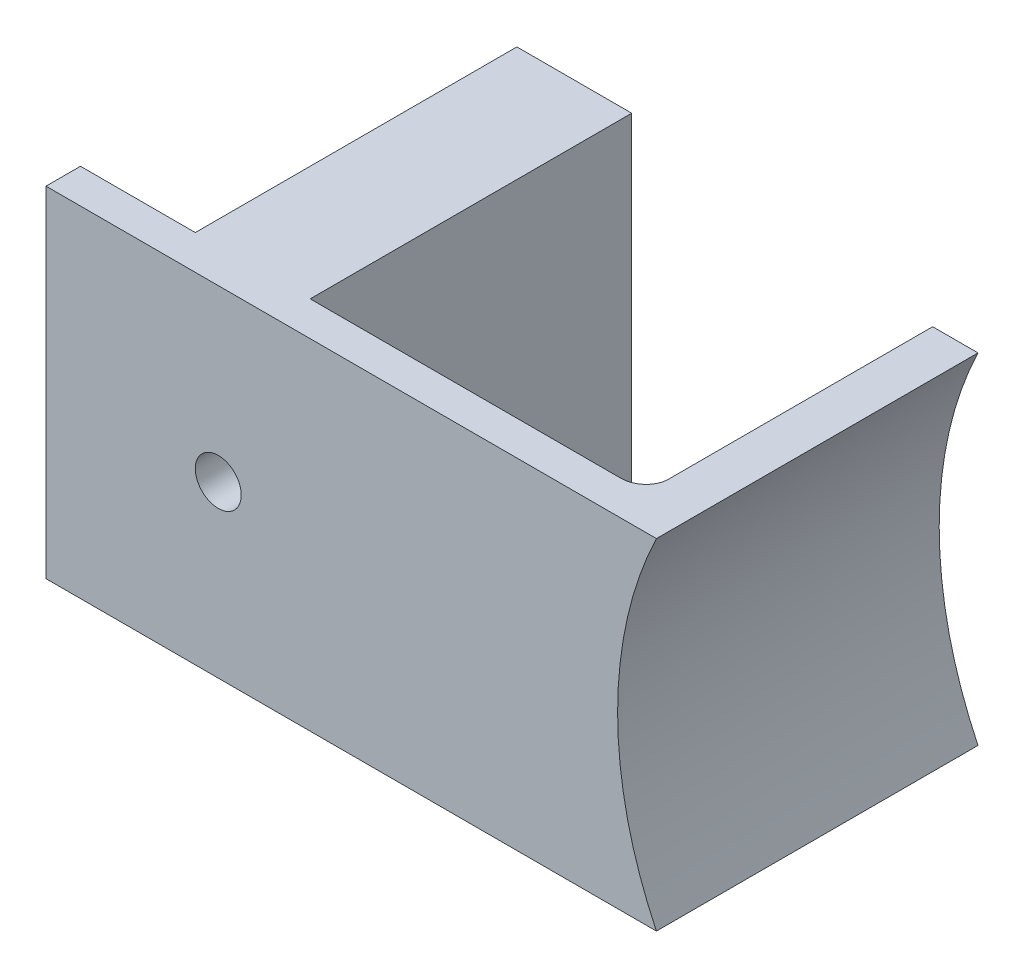
ISO-10303-21;
HEADER;
FILE_DESCRIPTION(('STEP AP214'),'2;1');
FILE_NAME('part.step','',(''),(''),'','','');
FILE_SCHEMA(('AUTOMOTIVE_DESIGN { 1 0 10303 214 1 1 1 1 }'));
ENDSEC;
DATA;
#1=APPLICATION_CONTEXT('core data for automotive mechanical design processes');
#2=APPLICATION_PROTOCOL_DEFINITION('international standard','automotive_design',2000,#1);
#3=PRODUCT_CONTEXT('',#1,'mechanical');
#4=PRODUCT('Part','Part','',(#3));
#5=PRODUCT_RELATED_PRODUCT_CATEGORY('part','',(#4));
#6=PRODUCT_DEFINITION_FORMATION('','',#4);
#7=PRODUCT_DEFINITION_CONTEXT('part definition',#1,'design');
#8=PRODUCT_DEFINITION('design','',#6,#7);
#9=PRODUCT_DEFINITION_SHAPE('','',#8);
#10=(LENGTH_UNIT() NAMED_UNIT(*) SI_UNIT(.MILLI.,.METRE.));
#11=(NAMED_UNIT(*) PLANE_ANGLE_UNIT() SI_UNIT($,.RADIAN.));
#12=(NAMED_UNIT(*) SI_UNIT($,.STERADIAN.) SOLID_ANGLE_UNIT());
#13=UNCERTAINTY_MEASURE_WITH_UNIT(LENGTH_MEASURE(1.E-05),#10,'distance_accuracy_value','');
#14=(GEOMETRIC_REPRESENTATION_CONTEXT(3) GLOBAL_UNCERTAINTY_ASSIGNED_CONTEXT((#13)) GLOBAL_UNIT_ASSIGNED_CONTEXT((#10,
#11,#12)) REPRESENTATION_CONTEXT('',''));
#15=CARTESIAN_POINT('',(0.,0.,0.));
#16=DIRECTION('',(0.,0.,1.));
#17=DIRECTION('',(1.,0.,0.));
#18=AXIS2_PLACEMENT_3D('',#15,#16,#17);
#19=CARTESIAN_POINT('',(2.50538527144924,-1.02140518265514E-13,25.));
#20=DIRECTION('',(0.,0.,1.));
#21=DIRECTION('',(1.,0.,0.));
#22=AXIS2_PLACEMENT_3D('',#19,#20,#21);
#23=PLANE('',#22);
#24=DIRECTION('',(-1.,0.,0.));
#25=VECTOR('',#24,1.);
#26=CARTESIAN_POINT('',(-71.3654900853092,14.7999999999996,25.));
#27=LINE('',#26,#25);
#28=CARTESIAN_POINT('',(-34.3301957244099,14.7999999999996,25.));
#29=VERTEX_POINT('',#28);
#30=CARTESIAN_POINT('',(-61.3654900853092,14.7999999999996,25.));
#31=VERTEX_POINT('',#30);
#32=EDGE_CURVE('E438',#29,#31,#27,.T.);
#33=ORIENTED_EDGE('',*,*,#32,.F.);
#34=CARTESIAN_POINT('',(2.50538527144924,-1.02140518265514E-13,25.));
#35=DIRECTION('',(0.,0.,1.));
#36=DIRECTION('',(1.,0.,0.));
#37=AXIS2_PLACEMENT_3D('',#34,#35,#36);
#38=CIRCLE('',#37,39.6976073246549);
#39=CARTESIAN_POINT('',(-34.3301957244099,-14.7999999999999,25.));
#40=VERTEX_POINT('',#39);
#41=EDGE_CURVE('E59',#29,#40,#38,.T.);
#42=ORIENTED_EDGE('',*,*,#41,.T.);
#43=DIRECTION('',(1.,0.,0.));
#44=VECTOR('',#43,1.);
#45=CARTESIAN_POINT('',(-32.1654900853092,-14.7999999999999,25.));
#46=LINE('',#45,#44);
#47=CARTESIAN_POINT('',(-61.3654900853092,-14.7999999999999,25.));
#48=VERTEX_POINT('',#47);
#49=EDGE_CURVE('E440',#48,#40,#46,.T.);
#50=ORIENTED_EDGE('',*,*,#49,.F.);
#51=DIRECTION('',(0.,-1.,0.));
#52=VECTOR('',#51,1.);
#53=CARTESIAN_POINT('',(-61.3654900853092,-14.7999999999999,25.));
#54=LINE('',#53,#52);
#55=CARTESIAN_POINT('',(-61.3654900853092,-5.00000000000015,25.));
#56=VERTEX_POINT('',#55);
#57=EDGE_CURVE('E418',#56,#48,#54,.T.);
#58=ORIENTED_EDGE('',*,*,#57,.F.);
#59=DIRECTION('',(1.,0.,0.));
#60=VECTOR('',#59,1.);
#61=CARTESIAN_POINT('',(-65.8654900853092,-5.00000000000015,25.));
#62=LINE('',#61,#60);
#63=CARTESIAN_POINT('',(-58.1154900853092,-5.00000000000014,25.));
#64=VERTEX_POINT('',#63);
#65=EDGE_CURVE('E416',#56,#64,#62,.T.);
#66=ORIENTED_EDGE('',*,*,#65,.T.);
#67=DIRECTION('',(0.,1.,0.));
#68=VECTOR('',#67,1.);
#69=CARTESIAN_POINT('',(-58.1154900853092,-5.00000000000014,25.));
#70=LINE('',#69,#68);
#71=CARTESIAN_POINT('',(-58.1154900853092,4.99999999999986,25.));
#72=VERTEX_POINT('',#71);
#73=EDGE_CURVE('E406',#64,#72,#70,.T.);
#74=ORIENTED_EDGE('',*,*,#73,.T.);
#75=DIRECTION('',(1.,0.,0.));
#76=VECTOR('',#75,1.);
#77=CARTESIAN_POINT('',(-65.8654900853092,4.99999999999985,25.));
#78=LINE('',#77,#76);
#79=CARTESIAN_POINT('',(-61.3654900853092,4.99999999999985,25.));
#80=VERTEX_POINT('',#79);
#81=EDGE_CURVE('E413',#80,#72,#78,.T.);
#82=ORIENTED_EDGE('',*,*,#81,.F.);
#83=EDGE_CURVE('E423',#31,#80,#54,.T.);
#84=ORIENTED_EDGE('',*,*,#83,.F.);
#85=EDGE_LOOP('',(#33,#42,#50,#58,#66,#74,#82,#84));
#86=FACE_BOUND('',#85,.T.);
#87=ADVANCED_FACE('F33',(#86),#23,.F.);
#88=CARTESIAN_POINT('',(-61.3654900853092,-14.7999999999999,-3.));
#89=DIRECTION('',(-1.,0.,0.));
#90=DIRECTION('',(0.,0.,1.));
#91=AXIS2_PLACEMENT_3D('',#88,#89,#90);
#92=PLANE('',#91);
#93=CARTESIAN_POINT('',(-61.3654900853092,-1.45921469352217E-13,25.));
#94=DIRECTION('',(-1.,0.,0.));
#95=DIRECTION('',(0.,0.,1.));
#96=AXIS2_PLACEMENT_3D('',#93,#94,#95);
#97=CIRCLE('',#96,5.);
#98=EDGE_CURVE('E205',#56,#80,#97,.F.);
#99=ORIENTED_EDGE('',*,*,#98,.F.);
#100=ORIENTED_EDGE('',*,*,#57,.T.);
#101=DIRECTION('',(0.,0.,1.));
#102=VECTOR('',#101,1.);
#103=CARTESIAN_POINT('',(-61.3654900853092,-14.7999999999999,-3.));
#104=LINE('',#103,#102);
#105=CARTESIAN_POINT('',(-61.3654900853092,-14.7999999999999,-3.));
#106=VERTEX_POINT('',#105);
#107=EDGE_CURVE('E431',#106,#48,#104,.T.);
#108=ORIENTED_EDGE('',*,*,#107,.F.);
#109=DIRECTION('',(0.,-1.,0.));
#110=VECTOR('',#109,1.);
#111=CARTESIAN_POINT('',(-61.3654900853092,-14.7999999999999,-3.));
#112=LINE('',#111,#110);
#113=CARTESIAN_POINT('',(-61.3654900853092,14.7999999999996,-3.));
#114=VERTEX_POINT('',#113);
#115=EDGE_CURVE('E422',#114,#106,#112,.T.);
#116=ORIENTED_EDGE('',*,*,#115,.F.);
#117=DIRECTION('',(0.,0.,1.));
#118=VECTOR('',#117,1.);
#119=CARTESIAN_POINT('',(-61.3654900853092,14.7999999999996,-3.));
#120=LINE('',#119,#118);
#121=EDGE_CURVE('E435',#114,#31,#120,.T.);
#122=ORIENTED_EDGE('',*,*,#121,.T.);
#123=ORIENTED_EDGE('',*,*,#83,.T.);
#124=EDGE_LOOP('',(#99,#100,#108,#116,#122,#123));
#125=FACE_BOUND('',#124,.T.);
#126=ADVANCED_FACE('F230',(#125),#92,.F.);
#127=CARTESIAN_POINT('',(2.50538527144924,-1.02140518265514E-13,28.));
#128=DIRECTION('',(0.,0.,-1.));
#129=DIRECTION('',(-1.,0.,0.));
#130=AXIS2_PLACEMENT_3D('',#127,#128,#129);
#131=CYLINDRICAL_SURFACE('',#130,37.6976073246549);
#132=DIRECTION('',(0.,0.,-1.));
#133=VECTOR('',#132,1.);
#134=CARTESIAN_POINT('',(-32.1654900853092,-14.7999999999999,28.));
#135=LINE('',#134,#133);
#136=CARTESIAN_POINT('',(-32.1654900853092,-14.7999999999999,23.));
#137=VERTEX_POINT('',#136);
#138=CARTESIAN_POINT('',(-32.1654900853092,-14.7999999999999,0.));
#139=VERTEX_POINT('',#138);
#140=EDGE_CURVE('E186',#137,#139,#135,.T.);
#141=ORIENTED_EDGE('',*,*,#140,.F.);
#142=CARTESIAN_POINT('',(2.50538527144924,-1.02140518265514E-13,23.));
#143=DIRECTION('',(0.,0.,1.));
#144=DIRECTION('',(1.,0.,0.));
#145=AXIS2_PLACEMENT_3D('',#142,#143,#144);
#146=CIRCLE('',#145,37.6976073246549);
#147=CARTESIAN_POINT('',(-32.1654900853093,14.7999999999996,23.));
#148=VERTEX_POINT('',#147);
#149=EDGE_CURVE('E208',#137,#148,#146,.F.);
#150=ORIENTED_EDGE('',*,*,#149,.T.);
#151=DIRECTION('',(0.,0.,-1.));
#152=VECTOR('',#151,1.);
#153=CARTESIAN_POINT('',(-32.1654900853093,14.7999999999996,28.));
#154=LINE('',#153,#152);
#155=CARTESIAN_POINT('',(-32.1654900853093,14.7999999999996,0.));
#156=VERTEX_POINT('',#155);
#157=EDGE_CURVE('E201',#148,#156,#154,.T.);
#158=ORIENTED_EDGE('',*,*,#157,.T.);
#159=CARTESIAN_POINT('',(2.50538527144924,-1.02140518265514E-13,0.));
#160=DIRECTION('',(0.,0.,1.));
#161=DIRECTION('',(1.,0.,0.));
#162=AXIS2_PLACEMENT_3D('',#159,#160,#161);
#163=CIRCLE('',#162,37.6976073246549);
#164=EDGE_CURVE('E195',#156,#139,#163,.T.);
#165=ORIENTED_EDGE('',*,*,#164,.T.);
#166=EDGE_LOOP('',(#141,#150,#158,#165));
#167=FACE_BOUND('',#166,.T.);
#168=ADVANCED_FACE('F224',(#167),#131,.T.);
#169=CARTESIAN_POINT('',(2.50538527144924,-1.02140518265514E-13,28.));
#170=DIRECTION('',(0.,0.,-1.));
#171=DIRECTION('',(-1.,0.,0.));
#172=AXIS2_PLACEMENT_3D('',#169,#170,#171);
#173=CYLINDRICAL_SURFACE('',#172,34.0999999999995);
#174=CARTESIAN_POINT('',(2.50538527144924,-1.02140518265514E-13,0.));
#175=DIRECTION('',(0.,0.,-1.));
#176=DIRECTION('',(1.,0.,0.));
#177=AXIS2_PLACEMENT_3D('',#174,#175,#176);
#178=CIRCLE('',#177,34.0999999999995);
#179=CARTESIAN_POINT('',(-28.2154545608205,-14.7999999999999,0.));
#180=VERTEX_POINT('',#179);
#181=CARTESIAN_POINT('',(-28.2154545608205,14.7999999999996,0.));
#182=VERTEX_POINT('',#181);
#183=EDGE_CURVE('E190',#180,#182,#178,.T.);
#184=ORIENTED_EDGE('',*,*,#183,.T.);
#185=DIRECTION('',(0.,0.,-1.));
#186=VECTOR('',#185,1.);
#187=CARTESIAN_POINT('',(-28.2154545608205,14.7999999999996,28.));
#188=LINE('',#187,#186);
#189=CARTESIAN_POINT('',(-28.2154545608205,14.7999999999996,28.));
#190=VERTEX_POINT('',#189);
#191=EDGE_CURVE('E203',#190,#182,#188,.T.);
#192=ORIENTED_EDGE('',*,*,#191,.F.);
#193=CARTESIAN_POINT('',(2.50538527144924,-1.02140518265514E-13,28.));
#194=DIRECTION('',(0.,0.,-1.));
#195=DIRECTION('',(1.,0.,0.));
#196=AXIS2_PLACEMENT_3D('',#193,#194,#195);
#197=CIRCLE('',#196,34.0999999999995);
#198=CARTESIAN_POINT('',(-28.2154545608205,-14.7999999999999,28.));
#199=VERTEX_POINT('',#198);
#200=EDGE_CURVE('E138',#199,#190,#197,.T.);
#201=ORIENTED_EDGE('',*,*,#200,.F.);
#202=DIRECTION('',(0.,0.,-1.));
#203=VECTOR('',#202,1.);
#204=CARTESIAN_POINT('',(-28.2154545608205,-14.7999999999999,28.));
#205=LINE('',#204,#203);
#206=EDGE_CURVE('E184',#199,#180,#205,.T.);
#207=ORIENTED_EDGE('',*,*,#206,.T.);
#208=EDGE_LOOP('',(#184,#192,#201,#207));
#209=FACE_BOUND('',#208,.T.);
#210=ADVANCED_FACE('F223',(#209),#173,.F.);
#211=CARTESIAN_POINT('',(-32.1654900853093,14.7999999999996,28.));
#212=DIRECTION('',(0.,-1.,0.));
#213=DIRECTION('',(1.,0.,0.));
#214=AXIS2_PLACEMENT_3D('',#211,#212,#213);
#215=PLANE('',#214);
#216=DIRECTION('',(-1.,0.,0.));
#217=VECTOR('',#216,1.);
#218=CARTESIAN_POINT('',(-32.1654900853093,14.7999999999996,0.));
#219=LINE('',#218,#217);
#220=EDGE_CURVE('E193',#182,#156,#219,.T.);
#221=ORIENTED_EDGE('',*,*,#220,.T.);
#222=ORIENTED_EDGE('',*,*,#157,.F.);
#223=CARTESIAN_POINT('',(-32.1654900853093,14.7999999999996,23.));
#224=CARTESIAN_POINT('',(-32.1654817280774,14.7999999999996,23.0530545504842));
#225=CARTESIAN_POINT('',(-32.1677852972142,14.7999999999996,23.1061050254468));
#226=CARTESIAN_POINT('',(-32.1769521435486,14.7999999999996,23.2117991623579));
#227=CARTESIAN_POINT('',(-32.1838144129258,14.7999999999996,23.264442911622));
#228=CARTESIAN_POINT('',(-32.2020075629451,14.7999999999996,23.3687938374675));
#229=CARTESIAN_POINT('',(-32.2133251372577,14.7999999999996,23.4205033277089));
#230=CARTESIAN_POINT('',(-32.240296663104,14.7999999999996,23.5227648146413));
#231=CARTESIAN_POINT('',(-32.2559507086705,14.7999999999996,23.5733167862068));
#232=CARTESIAN_POINT('',(-32.3091843012897,14.7999999999996,23.7226736083378));
#233=CARTESIAN_POINT('',(-32.3530588555275,14.7999999999996,23.8193122670165));
#234=CARTESIAN_POINT('',(-32.4558745204158,14.7999999999996,24.0041601060442));
#235=CARTESIAN_POINT('',(-32.5148227532421,14.7999999999996,24.0923652745039));
#236=CARTESIAN_POINT('',(-32.6480095317735,14.7999999999996,24.2612964375369));
#237=CARTESIAN_POINT('',(-32.7227001476259,14.7999999999996,24.3416657643366));
#238=CARTESIAN_POINT('',(-32.8836573246251,14.7999999999996,24.4897999348817));
#239=CARTESIAN_POINT('',(-32.9699270347053,14.7999999999996,24.5575613378997));
#240=CARTESIAN_POINT('',(-33.1585448330245,14.7999999999996,24.6839838301317));
#241=CARTESIAN_POINT('',(-33.2616160093295,14.7999999999996,24.7415656427723));
#242=CARTESIAN_POINT('',(-33.4755113002035,14.7999999999996,24.8399138754743));
#243=CARTESIAN_POINT('',(-33.5863383757608,14.7999999999996,24.8806738320027));
#244=CARTESIAN_POINT('',(-33.802107965127,14.7999999999996,24.9416979027485));
#245=CARTESIAN_POINT('',(-33.9066083241437,14.7999999999996,24.9635420812357));
#246=CARTESIAN_POINT('',(-34.1174696687749,14.7999999999996,24.9926940661215));
#247=CARTESIAN_POINT('',(-34.2238278559641,14.7999999999996,25.0000221048243));
#248=CARTESIAN_POINT('',(-34.33019572441,14.7999999999996,25.));
#249=B_SPLINE_CURVE_WITH_KNOTS('',3,(#223,#224,#225,#226,#227,#228,#229,#230,#231,#232,#233,
#234,#235,#236,#237,#238,#239,#240,#241,#242,#243,#244,#245,#246,#247,#248),.UNSPECIFIED.,.F.,
.F.,(4,2,2,2,2,2,2,2,2,2,2,2,4),(0.,0.159106717146132,0.31817827127264,0.476778299262486,
0.635381766633597,0.952188908997179,1.2691460173337,1.59688932402275,1.92472194174268,
2.27740664362792,2.63022673316472,2.94950628022832,3.26834050787963),.UNSPECIFIED.);
#250=EDGE_CURVE('E43',#148,#29,#249,.T.);
#251=ORIENTED_EDGE('',*,*,#250,.T.);
#252=ORIENTED_EDGE('',*,*,#32,.T.);
#253=ORIENTED_EDGE('',*,*,#121,.F.);
#254=DIRECTION('',(1.,0.,0.));
#255=VECTOR('',#254,1.);
#256=CARTESIAN_POINT('',(-61.3654900853092,14.7999999999996,-3.));
#257=LINE('',#256,#255);
#258=CARTESIAN_POINT('',(-71.3654900853092,14.7999999999996,-3.));
#259=VERTEX_POINT('',#258);
#260=EDGE_CURVE('E419',#259,#114,#257,.T.);
#261=ORIENTED_EDGE('',*,*,#260,.F.);
#262=DIRECTION('',(0.,0.,1.));
#263=VECTOR('',#262,1.);
#264=CARTESIAN_POINT('',(-71.3654900853092,14.7999999999996,25.));
#265=LINE('',#264,#263);
#266=CARTESIAN_POINT('',(-71.3654900853092,14.7999999999996,25.));
#267=VERTEX_POINT('',#266);
#268=EDGE_CURVE('E441',#259,#267,#265,.T.);
#269=ORIENTED_EDGE('',*,*,#268,.T.);
#270=DIRECTION('',(1.,0.,0.));
#271=VECTOR('',#270,1.);
#272=CARTESIAN_POINT('',(-71.3654900853092,14.7999999999996,25.));
#273=LINE('',#272,#271);
#274=CARTESIAN_POINT('',(-81.3654900853092,14.7999999999996,25.));
#275=VERTEX_POINT('',#274);
#276=EDGE_CURVE('E150',#275,#267,#273,.T.);
#277=ORIENTED_EDGE('',*,*,#276,.F.);
#278=DIRECTION('',(0.,0.,1.));
#279=VECTOR('',#278,1.);
#280=CARTESIAN_POINT('',(-81.3654900853092,14.7999999999996,-6.24355933628518));
#281=LINE('',#280,#279);
#282=CARTESIAN_POINT('',(-81.3654900853092,14.7999999999996,28.));
#283=VERTEX_POINT('',#282);
#284=EDGE_CURVE('E146',#275,#283,#281,.T.);
#285=ORIENTED_EDGE('',*,*,#284,.T.);
#286=DIRECTION('',(-1.,0.,0.));
#287=VECTOR('',#286,1.);
#288=CARTESIAN_POINT('',(-32.1654900853093,14.7999999999996,28.));
#289=LINE('',#288,#287);
#290=EDGE_CURVE('E132',#190,#283,#289,.T.);
#291=ORIENTED_EDGE('',*,*,#290,.F.);
#292=ORIENTED_EDGE('',*,*,#191,.T.);
#293=EDGE_LOOP('',(#221,#222,#251,#252,#253,#261,#269,#277,#285,#291,#292));
#294=FACE_BOUND('',#293,.T.);
#295=ADVANCED_FACE('F148',(#294),#215,.F.);
#296=CARTESIAN_POINT('',(-28.2154545608205,-14.7999999999999,28.));
#297=DIRECTION('',(0.,1.,0.));
#298=DIRECTION('',(0.,0.,1.));
#299=AXIS2_PLACEMENT_3D('',#296,#297,#298);
#300=PLANE('',#299);
#301=DIRECTION('',(1.,0.,0.));
#302=VECTOR('',#301,1.);
#303=CARTESIAN_POINT('',(-28.2154545608205,-14.7999999999999,0.));
#304=LINE('',#303,#302);
#305=EDGE_CURVE('E198',#139,#180,#304,.T.);
#306=ORIENTED_EDGE('',*,*,#305,.T.);
#307=ORIENTED_EDGE('',*,*,#206,.F.);
#308=DIRECTION('',(1.,0.,0.));
#309=VECTOR('',#308,1.);
#310=CARTESIAN_POINT('',(-28.2154545608205,-14.7999999999999,28.));
#311=LINE('',#310,#309);
#312=CARTESIAN_POINT('',(-81.3654900853092,-14.7999999999999,28.));
#313=VERTEX_POINT('',#312);
#314=EDGE_CURVE('E142',#313,#199,#311,.T.);
#315=ORIENTED_EDGE('',*,*,#314,.F.);
#316=DIRECTION('',(0.,0.,1.));
#317=VECTOR('',#316,1.);
#318=CARTESIAN_POINT('',(-81.3654900853092,-14.7999999999999,-6.24355933628518));
#319=LINE('',#318,#317);
#320=CARTESIAN_POINT('',(-81.3654900853092,-14.7999999999999,25.));
#321=VERTEX_POINT('',#320);
#322=EDGE_CURVE('E153',#321,#313,#319,.T.);
#323=ORIENTED_EDGE('',*,*,#322,.F.);
#324=DIRECTION('',(-1.,0.,0.));
#325=VECTOR('',#324,1.);
#326=CARTESIAN_POINT('',(-81.3654900853092,-14.7999999999999,25.));
#327=LINE('',#326,#325);
#328=CARTESIAN_POINT('',(-71.3654900853092,-14.7999999999999,25.));
#329=VERTEX_POINT('',#328);
#330=EDGE_CURVE('E171',#329,#321,#327,.T.);
#331=ORIENTED_EDGE('',*,*,#330,.F.);
#332=DIRECTION('',(0.,0.,1.));
#333=VECTOR('',#332,1.);
#334=CARTESIAN_POINT('',(-71.3654900853092,-14.7999999999999,25.));
#335=LINE('',#334,#333);
#336=CARTESIAN_POINT('',(-71.3654900853092,-14.7999999999999,-3.));
#337=VERTEX_POINT('',#336);
#338=EDGE_CURVE('E172',#337,#329,#335,.T.);
#339=ORIENTED_EDGE('',*,*,#338,.F.);
#340=DIRECTION('',(-1.,0.,0.));
#341=VECTOR('',#340,1.);
#342=CARTESIAN_POINT('',(-71.3654900853092,-14.7999999999999,-3.));
#343=LINE('',#342,#341);
#344=EDGE_CURVE('E425',#106,#337,#343,.T.);
#345=ORIENTED_EDGE('',*,*,#344,.F.);
#346=ORIENTED_EDGE('',*,*,#107,.T.);
#347=ORIENTED_EDGE('',*,*,#49,.T.);
#348=CARTESIAN_POINT('',(-34.3301957244099,-14.7999999999999,25.));
#349=CARTESIAN_POINT('',(-34.2655927494029,-14.7999999999999,24.9999969582741));
#350=CARTESIAN_POINT('',(-34.2010206842795,-14.7999999999999,24.997303511558));
#351=CARTESIAN_POINT('',(-34.0723202598233,-14.7999999999999,24.9865525191072));
#352=CARTESIAN_POINT('',(-34.0081919322759,-14.7999999999999,24.9784945930471));
#353=CARTESIAN_POINT('',(-33.8169834765301,-14.7999999999999,24.9462869782536));
#354=CARTESIAN_POINT('',(-33.6911576286863,-14.7999999999999,24.9141034929513));
#355=CARTESIAN_POINT('',(-33.4466718959961,-14.7999999999999,24.8288702716105));
#356=CARTESIAN_POINT('',(-33.3280199169112,-14.7999999999999,24.7757979823166));
#357=CARTESIAN_POINT('',(-33.1018121559092,-14.7999999999999,24.6497885131918));
#358=CARTESIAN_POINT('',(-32.9942481013267,-14.7999999999999,24.5768662934105));
#359=CARTESIAN_POINT('',(-32.797736349718,-14.7999999999999,24.4157039732662));
#360=CARTESIAN_POINT('',(-32.7082536293873,-14.7999999999999,24.3281178829581));
#361=CARTESIAN_POINT('',(-32.5467413929517,-14.7999999999999,24.1380207387133));
#362=CARTESIAN_POINT('',(-32.4747096273,-14.7999999999999,24.035511611188));
#363=CARTESIAN_POINT('',(-32.3562426275285,-14.7999999999999,23.8270341220181));
#364=CARTESIAN_POINT('',(-32.3082613758473,-14.7999999999999,23.7219427699291));
#365=CARTESIAN_POINT('',(-32.2322744745302,-14.7999999999999,23.5048579843575));
#366=CARTESIAN_POINT('',(-32.2042313902519,-14.7999999999999,23.3928779166906));
#367=CARTESIAN_POINT('',(-32.1797163927474,-14.7999999999999,23.2331626373114));
#368=CARTESIAN_POINT('',(-32.1743828299172,-14.7999999999999,23.186655816074));
#369=CARTESIAN_POINT('',(-32.167273219584,-14.7999999999999,23.0934410668375));
#370=CARTESIAN_POINT('',(-32.1654918599836,-14.7999999999999,23.0467335439684));
#371=CARTESIAN_POINT('',(-32.1654900853092,-14.7999999999999,23.));
#372=B_SPLINE_CURVE_WITH_KNOTS('',3,(#348,#349,#350,#351,#352,#353,#354,#355,#356,#357,#358,
#359,#360,#361,#362,#363,#364,#365,#366,#367,#368,#369,#370,#371),.UNSPECIFIED.,.F.,.F.,(4,2,2,
2,2,2,2,2,2,2,2,4),(0.,0.193691234172065,0.387396201930223,0.775036498009317,1.16309647532271,
1.55086479420664,1.92452172694991,2.29813046711302,2.64291562713539,2.98705171850427,
3.12737687843147,3.26749203302539),.UNSPECIFIED.);
#373=EDGE_CURVE('E11',#40,#137,#372,.T.);
#374=ORIENTED_EDGE('',*,*,#373,.T.);
#375=ORIENTED_EDGE('',*,*,#140,.T.);
#376=EDGE_LOOP('',(#306,#307,#315,#323,#331,#339,#345,#346,#347,#374,#375));
#377=FACE_BOUND('',#376,.T.);
#378=ADVANCED_FACE('F181',(#377),#300,.F.);
#379=CARTESIAN_POINT('',(2.50538527144924,-1.02140518265514E-13,28.));
#380=DIRECTION('',(0.,0.,1.));
#381=DIRECTION('',(1.,0.,0.));
#382=AXIS2_PLACEMENT_3D('',#379,#380,#381);
#383=PLANE('',#382);
#384=CARTESIAN_POINT('',(-66.3654900853092,-1.42579891361901E-13,28.));
#385=DIRECTION('',(0.,0.,1.));
#386=DIRECTION('',(1.,0.,0.));
#387=AXIS2_PLACEMENT_3D('',#384,#385,#386);
#388=CIRCLE('',#387,2.);
#389=CARTESIAN_POINT('',(-64.3654900853092,-1.42579891361901E-13,28.));
#390=VERTEX_POINT('',#389);
#391=EDGE_CURVE('E170',#390,#390,#388,.T.);
#392=ORIENTED_EDGE('',*,*,#391,.F.);
#393=EDGE_LOOP('',(#392));
#394=FACE_BOUND('',#393,.T.);
#395=ORIENTED_EDGE('',*,*,#200,.T.);
#396=ORIENTED_EDGE('',*,*,#290,.T.);
#397=DIRECTION('',(0.,-1.,0.));
#398=VECTOR('',#397,1.);
#399=CARTESIAN_POINT('',(-81.3654900853092,14.7999999999996,28.));
#400=LINE('',#399,#398);
#401=EDGE_CURVE('E136',#283,#313,#400,.T.);
#402=ORIENTED_EDGE('',*,*,#401,.T.);
#403=ORIENTED_EDGE('',*,*,#314,.T.);
#404=EDGE_LOOP('',(#395,#396,#402,#403));
#405=FACE_BOUND('',#404,.T.);
#406=ADVANCED_FACE('F134',(#394,#405),#383,.T.);
#407=CARTESIAN_POINT('',(2.50538527144924,-1.02140518265514E-13,0.));
#408=DIRECTION('',(0.,0.,1.));
#409=DIRECTION('',(1.,0.,0.));
#410=AXIS2_PLACEMENT_3D('',#407,#408,#409);
#411=PLANE('',#410);
#412=ORIENTED_EDGE('',*,*,#183,.F.);
#413=ORIENTED_EDGE('',*,*,#305,.F.);
#414=ORIENTED_EDGE('',*,*,#164,.F.);
#415=ORIENTED_EDGE('',*,*,#220,.F.);
#416=EDGE_LOOP('',(#412,#413,#414,#415));
#417=FACE_BOUND('',#416,.T.);
#418=ADVANCED_FACE('F245',(#417),#411,.F.);
#419=CARTESIAN_POINT('',(-71.3654900853092,-14.7999999999999,25.));
#420=DIRECTION('',(-1.,0.,0.));
#421=DIRECTION('',(0.,-1.,0.));
#422=AXIS2_PLACEMENT_3D('',#419,#420,#421);
#423=PLANE('',#422);
#424=DIRECTION('',(0.,-1.,0.));
#425=VECTOR('',#424,1.);
#426=CARTESIAN_POINT('',(-71.3654900853092,-14.7999999999999,25.));
#427=LINE('',#426,#425);
#428=EDGE_CURVE('E51',#267,#329,#427,.T.);
#429=ORIENTED_EDGE('',*,*,#428,.F.);
#430=ORIENTED_EDGE('',*,*,#268,.F.);
#431=DIRECTION('',(0.,1.,0.));
#432=VECTOR('',#431,1.);
#433=CARTESIAN_POINT('',(-71.3654900853092,14.7999999999996,-3.));
#434=LINE('',#433,#432);
#435=EDGE_CURVE('E428',#337,#259,#434,.T.);
#436=ORIENTED_EDGE('',*,*,#435,.F.);
#437=ORIENTED_EDGE('',*,*,#338,.T.);
#438=EDGE_LOOP('',(#429,#430,#436,#437));
#439=FACE_BOUND('',#438,.T.);
#440=ADVANCED_FACE('F241',(#439),#423,.T.);
#441=CARTESIAN_POINT('',(0.,0.,-3.));
#442=DIRECTION('',(0.,0.,1.));
#443=DIRECTION('',(1.,0.,0.));
#444=AXIS2_PLACEMENT_3D('',#441,#442,#443);
#445=PLANE('',#444);
#446=ORIENTED_EDGE('',*,*,#260,.T.);
#447=ORIENTED_EDGE('',*,*,#115,.T.);
#448=ORIENTED_EDGE('',*,*,#344,.T.);
#449=ORIENTED_EDGE('',*,*,#435,.T.);
#450=EDGE_LOOP('',(#446,#447,#448,#449));
#451=FACE_BOUND('',#450,.T.);
#452=ADVANCED_FACE('F244',(#451),#445,.F.);
#453=CARTESIAN_POINT('',(-65.8654900853092,-1.48606821293029E-13,25.));
#454=DIRECTION('',(1.,0.,0.));
#455=DIRECTION('',(0.,1.,0.));
#456=AXIS2_PLACEMENT_3D('',#453,#454,#455);
#457=CYLINDRICAL_SURFACE('',#456,5.);
#458=ORIENTED_EDGE('',*,*,#65,.F.);
#459=ORIENTED_EDGE('',*,*,#98,.T.);
#460=ORIENTED_EDGE('',*,*,#81,.T.);
#461=CARTESIAN_POINT('',(-58.1154900853092,-1.43982048506075E-13,25.));
#462=DIRECTION('',(-1.,0.,0.));
#463=DIRECTION('',(0.,-1.,0.));
#464=AXIS2_PLACEMENT_3D('',#461,#462,#463);
#465=CIRCLE('',#464,5.);
#466=EDGE_CURVE('E404',#72,#64,#465,.T.);
#467=ORIENTED_EDGE('',*,*,#466,.T.);
#468=EDGE_LOOP('',(#458,#459,#460,#467));
#469=FACE_BOUND('',#468,.T.);
#470=ADVANCED_FACE('F276',(#469),#457,.T.);
#471=CARTESIAN_POINT('',(-58.1154900853092,-1.43982048506075E-13,25.));
#472=DIRECTION('',(-1.,0.,0.));
#473=DIRECTION('',(0.,-1.,0.));
#474=AXIS2_PLACEMENT_3D('',#471,#472,#473);
#475=PLANE('',#474);
#476=ORIENTED_EDGE('',*,*,#466,.F.);
#477=ORIENTED_EDGE('',*,*,#73,.F.);
#478=EDGE_LOOP('',(#476,#477));
#479=FACE_BOUND('',#478,.T.);
#480=ADVANCED_FACE('F284',(#479),#475,.F.);
#481=CARTESIAN_POINT('',(2.50538527144924,-1.02140518265514E-13,23.));
#482=DIRECTION('',(0.,0.,1.));
#483=DIRECTION('',(1.,0.,0.));
#484=AXIS2_PLACEMENT_3D('',#481,#482,#483);
#485=TOROIDAL_SURFACE('',#484,39.6976073246549,2.);
#486=ORIENTED_EDGE('',*,*,#373,.F.);
#487=ORIENTED_EDGE('',*,*,#41,.F.);
#488=ORIENTED_EDGE('',*,*,#250,.F.);
#489=ORIENTED_EDGE('',*,*,#149,.F.);
#490=EDGE_LOOP('',(#486,#487,#488,#489));
#491=FACE_BOUND('',#490,.T.);
#492=ADVANCED_FACE('F35',(#491),#485,.F.);
#493=CARTESIAN_POINT('',(-66.3654900853092,-1.42579891361901E-13,5.));
#494=DIRECTION('',(0.,0.,1.));
#495=DIRECTION('',(1.,0.,0.));
#496=AXIS2_PLACEMENT_3D('',#493,#494,#495);
#497=CYLINDRICAL_SURFACE('',#496,2.);
#498=CARTESIAN_POINT('',(-66.3654900853092,-1.42579891361901E-13,5.));
#499=DIRECTION('',(0.,0.,1.));
#500=DIRECTION('',(1.,0.,0.));
#501=AXIS2_PLACEMENT_3D('',#498,#499,#500);
#502=CIRCLE('',#501,2.);
#503=CARTESIAN_POINT('',(-64.3654900853092,-1.42579891361901E-13,5.));
#504=VERTEX_POINT('',#503);
#505=EDGE_CURVE('E165',#504,#504,#502,.T.);
#506=ORIENTED_EDGE('',*,*,#505,.F.);
#507=EDGE_LOOP('',(#506));
#508=FACE_BOUND('',#507,.T.);
#509=ORIENTED_EDGE('',*,*,#391,.T.);
#510=EDGE_LOOP('',(#509));
#511=FACE_BOUND('',#510,.T.);
#512=ADVANCED_FACE('F299',(#508,#511),#497,.F.);
#513=CARTESIAN_POINT('',(-66.3654900853092,-1.42579891361901E-13,5.));
#514=DIRECTION('',(0.,0.,1.));
#515=DIRECTION('',(1.,0.,0.));
#516=AXIS2_PLACEMENT_3D('',#513,#514,#515);
#517=PLANE('',#516);
#518=ORIENTED_EDGE('',*,*,#505,.T.);
#519=EDGE_LOOP('',(#518));
#520=FACE_BOUND('',#519,.T.);
#521=ADVANCED_FACE('F307',(#520),#517,.T.);
#522=CARTESIAN_POINT('',(-81.3654900853092,14.7999999999996,-6.24355933628518));
#523=DIRECTION('',(-1.,0.,0.));
#524=DIRECTION('',(0.,-1.,0.));
#525=AXIS2_PLACEMENT_3D('',#522,#523,#524);
#526=PLANE('',#525);
#527=DIRECTION('',(0.,1.,0.));
#528=VECTOR('',#527,1.);
#529=CARTESIAN_POINT('',(-81.3654900853092,14.7999999999996,25.));
#530=LINE('',#529,#528);
#531=EDGE_CURVE('E161',#321,#275,#530,.T.);
#532=ORIENTED_EDGE('',*,*,#531,.F.);
#533=ORIENTED_EDGE('',*,*,#322,.T.);
#534=ORIENTED_EDGE('',*,*,#401,.F.);
#535=ORIENTED_EDGE('',*,*,#284,.F.);
#536=EDGE_LOOP('',(#532,#533,#534,#535));
#537=FACE_BOUND('',#536,.T.);
#538=ADVANCED_FACE('F156',(#537),#526,.T.);
#539=CARTESIAN_POINT('',(2.50538527144924,-1.02140518265514E-13,25.));
#540=DIRECTION('',(0.,0.,1.));
#541=DIRECTION('',(1.,0.,0.));
#542=AXIS2_PLACEMENT_3D('',#539,#540,#541);
#543=PLANE('',#542);
#544=ORIENTED_EDGE('',*,*,#330,.T.);
#545=ORIENTED_EDGE('',*,*,#531,.T.);
#546=ORIENTED_EDGE('',*,*,#276,.T.);
#547=ORIENTED_EDGE('',*,*,#428,.T.);
#548=EDGE_LOOP('',(#544,#545,#546,#547));
#549=FACE_BOUND('',#548,.T.);
#550=ADVANCED_FACE('F178',(#549),#543,.F.);
#551=CLOSED_SHELL('',(#87,#126,#168,#210,#295,#378,#406,#418,#440,#452,#470,#480,#492,#512,#521,
#538,#550));
#552=MANIFOLD_SOLID_BREP('B2',#551);
#553=ADVANCED_BREP_SHAPE_REPRESENTATION('',(#18,#552),#14);
#554=SHAPE_DEFINITION_REPRESENTATION(#9,#553);
ENDSEC;
END-ISO-10303-21;
